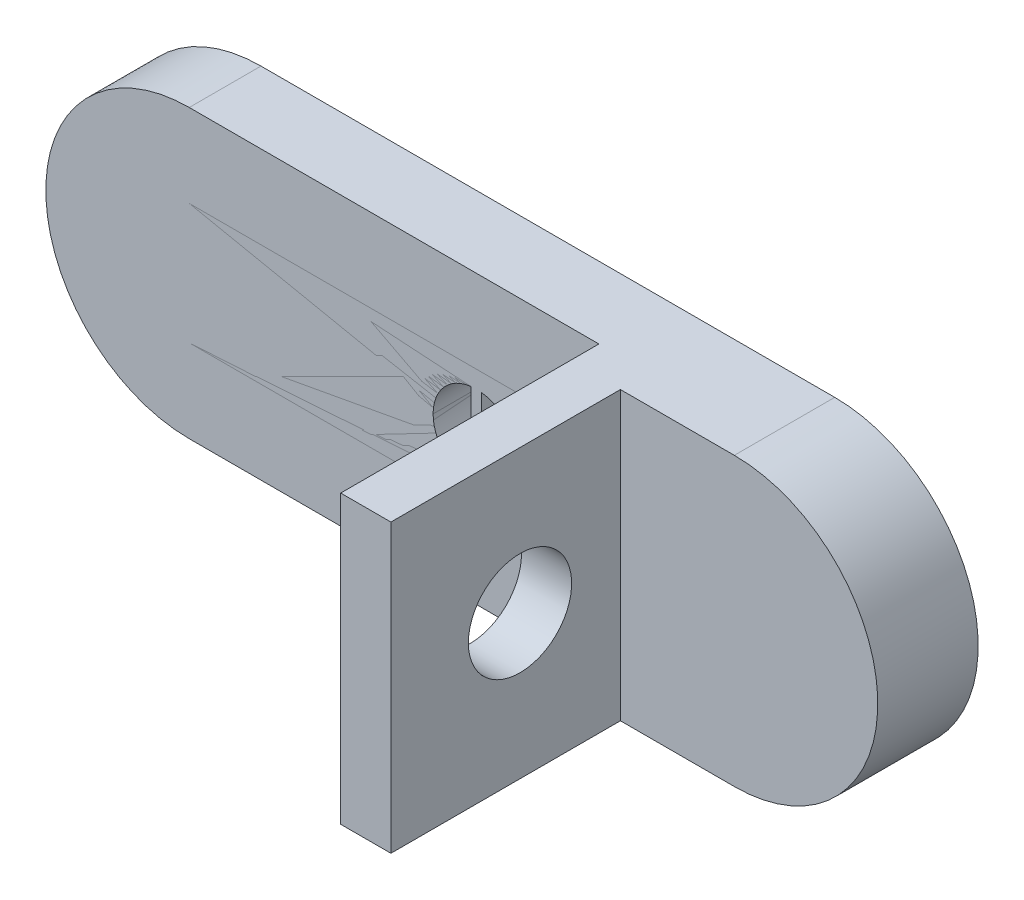
ISO-10303-21;
HEADER;
FILE_DESCRIPTION(('STEP AP214'),'2;1');
FILE_NAME('part.step','',(''),(''),'','','');
FILE_SCHEMA(('AUTOMOTIVE_DESIGN { 1 0 10303 214 1 1 1 1 }'));
ENDSEC;
DATA;
#1=APPLICATION_CONTEXT('core data for automotive mechanical design processes');
#2=APPLICATION_PROTOCOL_DEFINITION('international standard','automotive_design',2000,#1);
#3=PRODUCT_CONTEXT('',#1,'mechanical');
#4=PRODUCT('Part','Part','',(#3));
#5=PRODUCT_RELATED_PRODUCT_CATEGORY('part','',(#4));
#6=PRODUCT_DEFINITION_FORMATION('','',#4);
#7=PRODUCT_DEFINITION_CONTEXT('part definition',#1,'design');
#8=PRODUCT_DEFINITION('design','',#6,#7);
#9=PRODUCT_DEFINITION_SHAPE('','',#8);
#10=(LENGTH_UNIT() NAMED_UNIT(*) SI_UNIT(.MILLI.,.METRE.));
#11=(NAMED_UNIT(*) PLANE_ANGLE_UNIT() SI_UNIT($,.RADIAN.));
#12=(NAMED_UNIT(*) SI_UNIT($,.STERADIAN.) SOLID_ANGLE_UNIT());
#13=UNCERTAINTY_MEASURE_WITH_UNIT(LENGTH_MEASURE(1.E-05),#10,'distance_accuracy_value','');
#14=(GEOMETRIC_REPRESENTATION_CONTEXT(3) GLOBAL_UNCERTAINTY_ASSIGNED_CONTEXT((#13)) GLOBAL_UNIT_ASSIGNED_CONTEXT((#10,
#11,#12)) REPRESENTATION_CONTEXT('',''));
#15=CARTESIAN_POINT('',(0.,0.,0.));
#16=DIRECTION('',(0.,0.,1.));
#17=DIRECTION('',(1.,0.,0.));
#18=AXIS2_PLACEMENT_3D('',#15,#16,#17);
#19=CARTESIAN_POINT('',(0.,0.,5.));
#20=DIRECTION('',(0.,0.,-1.));
#21=DIRECTION('',(-1.,0.,0.));
#22=AXIS2_PLACEMENT_3D('',#19,#20,#21);
#23=CYLINDRICAL_SURFACE('',#22,3.);
#24=CARTESIAN_POINT('',(0.,0.,0.));
#25=DIRECTION('',(0.,0.,1.));
#26=DIRECTION('',(1.,0.,0.));
#27=AXIS2_PLACEMENT_3D('',#24,#25,#26);
#28=CIRCLE('',#27,3.);
#29=CARTESIAN_POINT('',(-0.375,2.97647022494767,0.));
#30=VERTEX_POINT('',#29);
#31=CARTESIAN_POINT('',(-0.375,-2.97647022494766,0.));
#32=VERTEX_POINT('',#31);
#33=EDGE_CURVE('E161',#30,#32,#28,.T.);
#34=ORIENTED_EDGE('',*,*,#33,.F.);
#35=DIRECTION('',(0.,0.,-1.));
#36=VECTOR('',#35,1.);
#37=CARTESIAN_POINT('',(-0.375,2.97647022494767,5.));
#38=LINE('',#37,#36);
#39=CARTESIAN_POINT('',(-0.375,2.97647022494767,5.));
#40=VERTEX_POINT('',#39);
#41=EDGE_CURVE('E13',#40,#30,#38,.T.);
#42=ORIENTED_EDGE('',*,*,#41,.F.);
#43=CARTESIAN_POINT('',(0.,0.,5.));
#44=DIRECTION('',(0.,0.,1.));
#45=DIRECTION('',(1.,0.,0.));
#46=AXIS2_PLACEMENT_3D('',#43,#44,#45);
#47=CIRCLE('',#46,3.);
#48=CARTESIAN_POINT('',(-0.375,-2.97647022494766,5.));
#49=VERTEX_POINT('',#48);
#50=EDGE_CURVE('E91',#40,#49,#47,.T.);
#51=ORIENTED_EDGE('',*,*,#50,.T.);
#52=DIRECTION('',(0.,0.,-1.));
#53=VECTOR('',#52,1.);
#54=CARTESIAN_POINT('',(-0.375,-2.97647022494766,5.));
#55=LINE('',#54,#53);
#56=EDGE_CURVE('E168',#49,#32,#55,.T.);
#57=ORIENTED_EDGE('',*,*,#56,.T.);
#58=EDGE_LOOP('',(#34,#42,#51,#57));
#59=FACE_BOUND('',#58,.T.);
#60=ADVANCED_FACE('F67',(#59),#23,.F.);
#61=CARTESIAN_POINT('',(0.375,-2.97647022494766,0.));
#62=VERTEX_POINT('',#61);
#63=CARTESIAN_POINT('',(0.375,2.97647022494767,0.));
#64=VERTEX_POINT('',#63);
#65=EDGE_CURVE('E109',#62,#64,#28,.T.);
#66=ORIENTED_EDGE('',*,*,#65,.F.);
#67=DIRECTION('',(0.,0.,-1.));
#68=VECTOR('',#67,1.);
#69=CARTESIAN_POINT('',(0.375,-2.97647022494766,5.));
#70=LINE('',#69,#68);
#71=CARTESIAN_POINT('',(0.375,-2.97647022494766,5.));
#72=VERTEX_POINT('',#71);
#73=EDGE_CURVE('E172',#72,#62,#70,.T.);
#74=ORIENTED_EDGE('',*,*,#73,.F.);
#75=CARTESIAN_POINT('',(0.375,2.97647022494767,5.));
#76=VERTEX_POINT('',#75);
#77=EDGE_CURVE('E173',#72,#76,#47,.T.);
#78=ORIENTED_EDGE('',*,*,#77,.T.);
#79=DIRECTION('',(0.,0.,-1.));
#80=VECTOR('',#79,1.);
#81=CARTESIAN_POINT('',(0.375,2.97647022494767,5.));
#82=LINE('',#81,#80);
#83=EDGE_CURVE('E75',#76,#64,#82,.T.);
#84=ORIENTED_EDGE('',*,*,#83,.T.);
#85=EDGE_LOOP('',(#66,#74,#78,#84));
#86=FACE_BOUND('',#85,.T.);
#87=ADVANCED_FACE('F69',(#86),#23,.F.);
#88=CARTESIAN_POINT('',(0.,0.,5.));
#89=DIRECTION('',(0.,0.,1.));
#90=DIRECTION('',(1.,0.,0.));
#91=AXIS2_PLACEMENT_3D('',#88,#89,#90);
#92=PLANE('',#91);
#93=ORIENTED_EDGE('',*,*,#77,.F.);
#94=DIRECTION('',(0.,1.,0.));
#95=VECTOR('',#94,1.);
#96=CARTESIAN_POINT('',(0.375,-3.,5.));
#97=LINE('',#96,#95);
#98=EDGE_CURVE('E176',#72,#76,#97,.T.);
#99=ORIENTED_EDGE('',*,*,#98,.T.);
#100=EDGE_LOOP('',(#93,#99));
#101=FACE_BOUND('',#100,.T.);
#102=DIRECTION('',(0.,-1.,0.));
#103=VECTOR('',#102,1.);
#104=CARTESIAN_POINT('',(8.55812951551174,0.,5.));
#105=LINE('',#104,#103);
#106=CARTESIAN_POINT('',(8.55812951551174,9.99999999999999,5.));
#107=VERTEX_POINT('',#106);
#108=CARTESIAN_POINT('',(8.55812951551174,-10.,5.));
#109=VERTEX_POINT('',#108);
#110=EDGE_CURVE('E217',#107,#109,#105,.T.);
#111=ORIENTED_EDGE('',*,*,#110,.F.);
#112=DIRECTION('',(1.,0.,0.));
#113=VECTOR('',#112,1.);
#114=CARTESIAN_POINT('',(0.,10.,5.));
#115=LINE('',#114,#113);
#116=CARTESIAN_POINT('',(-20.,9.99999999999999,5.));
#117=VERTEX_POINT('',#116);
#118=EDGE_CURVE('E228',#117,#107,#115,.T.);
#119=ORIENTED_EDGE('',*,*,#118,.F.);
#120=CARTESIAN_POINT('',(-20.,0.,5.));
#121=DIRECTION('',(0.,0.,1.));
#122=DIRECTION('',(1.,0.,0.));
#123=AXIS2_PLACEMENT_3D('',#120,#121,#122);
#124=CIRCLE('',#123,10.);
#125=CARTESIAN_POINT('',(-20.,-10.,5.));
#126=VERTEX_POINT('',#125);
#127=EDGE_CURVE('E232',#117,#126,#124,.T.);
#128=ORIENTED_EDGE('',*,*,#127,.T.);
#129=DIRECTION('',(1.,0.,0.));
#130=VECTOR('',#129,1.);
#131=CARTESIAN_POINT('',(0.,-10.,5.));
#132=LINE('',#131,#130);
#133=EDGE_CURVE('E225',#126,#109,#132,.T.);
#134=ORIENTED_EDGE('',*,*,#133,.T.);
#135=EDGE_LOOP('',(#111,#119,#128,#134));
#136=FACE_BOUND('',#135,.T.);
#137=ORIENTED_EDGE('',*,*,#50,.F.);
#138=DIRECTION('',(0.,1.,0.));
#139=VECTOR('',#138,1.);
#140=CARTESIAN_POINT('',(-0.375,-3.,5.));
#141=LINE('',#140,#139);
#142=EDGE_CURVE('E180',#49,#40,#141,.T.);
#143=ORIENTED_EDGE('',*,*,#142,.F.);
#144=EDGE_LOOP('',(#137,#143));
#145=FACE_BOUND('',#144,.T.);
#146=ADVANCED_FACE('F260',(#101,#136,#145),#92,.T.);
#147=CARTESIAN_POINT('',(0.,0.,0.));
#148=DIRECTION('',(0.,0.,1.));
#149=DIRECTION('',(1.,0.,0.));
#150=AXIS2_PLACEMENT_3D('',#147,#148,#149);
#151=PLANE('',#150);
#152=DIRECTION('',(0.,1.,0.));
#153=VECTOR('',#152,1.);
#154=CARTESIAN_POINT('',(0.375,-3.,0.));
#155=LINE('',#154,#153);
#156=EDGE_CURVE('E177',#62,#64,#155,.T.);
#157=ORIENTED_EDGE('',*,*,#156,.F.);
#158=ORIENTED_EDGE('',*,*,#65,.T.);
#159=EDGE_LOOP('',(#157,#158));
#160=FACE_BOUND('',#159,.T.);
#161=ORIENTED_EDGE('',*,*,#33,.T.);
#162=DIRECTION('',(0.,1.,0.));
#163=VECTOR('',#162,1.);
#164=CARTESIAN_POINT('',(-0.375,-3.,0.));
#165=LINE('',#164,#163);
#166=EDGE_CURVE('E165',#32,#30,#165,.T.);
#167=ORIENTED_EDGE('',*,*,#166,.T.);
#168=EDGE_LOOP('',(#161,#167));
#169=FACE_BOUND('',#168,.T.);
#170=DIRECTION('',(1.,0.,0.));
#171=VECTOR('',#170,1.);
#172=CARTESIAN_POINT('',(0.,10.,0.));
#173=LINE('',#172,#171);
#174=CARTESIAN_POINT('',(-20.,9.99999999999999,0.));
#175=VERTEX_POINT('',#174);
#176=CARTESIAN_POINT('',(20.,10.,0.));
#177=VERTEX_POINT('',#176);
#178=EDGE_CURVE('E239',#175,#177,#173,.T.);
#179=ORIENTED_EDGE('',*,*,#178,.T.);
#180=CARTESIAN_POINT('',(20.,0.,0.));
#181=DIRECTION('',(0.,0.,1.));
#182=DIRECTION('',(1.,0.,0.));
#183=AXIS2_PLACEMENT_3D('',#180,#181,#182);
#184=CIRCLE('',#183,10.);
#185=CARTESIAN_POINT('',(20.,-10.,0.));
#186=VERTEX_POINT('',#185);
#187=EDGE_CURVE('E236',#186,#177,#184,.T.);
#188=ORIENTED_EDGE('',*,*,#187,.F.);
#189=DIRECTION('',(1.,0.,0.));
#190=VECTOR('',#189,1.);
#191=CARTESIAN_POINT('',(0.,-10.,0.));
#192=LINE('',#191,#190);
#193=CARTESIAN_POINT('',(-20.,-10.,0.));
#194=VERTEX_POINT('',#193);
#195=EDGE_CURVE('E224',#194,#186,#192,.T.);
#196=ORIENTED_EDGE('',*,*,#195,.F.);
#197=CARTESIAN_POINT('',(-20.,0.,0.));
#198=DIRECTION('',(0.,0.,1.));
#199=DIRECTION('',(1.,0.,0.));
#200=AXIS2_PLACEMENT_3D('',#197,#198,#199);
#201=CIRCLE('',#200,10.);
#202=EDGE_CURVE('E229',#175,#194,#201,.T.);
#203=ORIENTED_EDGE('',*,*,#202,.F.);
#204=EDGE_LOOP('',(#179,#188,#196,#203));
#205=FACE_BOUND('',#204,.T.);
#206=ADVANCED_FACE('F162',(#160,#169,#205),#151,.F.);
#207=CARTESIAN_POINT('',(0.,-10.,5.));
#208=DIRECTION('',(0.,1.,0.));
#209=DIRECTION('',(-1.,0.,0.));
#210=AXIS2_PLACEMENT_3D('',#207,#208,#209);
#211=PLANE('',#210);
#212=DIRECTION('',(0.,0.,-1.));
#213=VECTOR('',#212,1.);
#214=CARTESIAN_POINT('',(20.,-10.,5.));
#215=LINE('',#214,#213);
#216=CARTESIAN_POINT('',(20.,-10.,7.));
#217=VERTEX_POINT('',#216);
#218=EDGE_CURVE('E166',#217,#186,#215,.T.);
#219=ORIENTED_EDGE('',*,*,#218,.F.);
#220=DIRECTION('',(-1.,0.,0.));
#221=VECTOR('',#220,1.);
#222=CARTESIAN_POINT('',(20.,-10.,7.));
#223=LINE('',#222,#221);
#224=CARTESIAN_POINT('',(12.0581295155117,-10.,7.));
#225=VERTEX_POINT('',#224);
#226=EDGE_CURVE('E190',#217,#225,#223,.T.);
#227=ORIENTED_EDGE('',*,*,#226,.T.);
#228=DIRECTION('',(0.,0.,1.));
#229=VECTOR('',#228,1.);
#230=CARTESIAN_POINT('',(12.0581295155117,-10.,0.));
#231=LINE('',#230,#229);
#232=CARTESIAN_POINT('',(12.0581295155117,-10.,23.));
#233=VERTEX_POINT('',#232);
#234=EDGE_CURVE('E82',#225,#233,#231,.T.);
#235=ORIENTED_EDGE('',*,*,#234,.T.);
#236=DIRECTION('',(1.,0.,0.));
#237=VECTOR('',#236,1.);
#238=CARTESIAN_POINT('',(8.55812951551174,-10.,23.));
#239=LINE('',#238,#237);
#240=CARTESIAN_POINT('',(8.55812951551174,-10.,23.));
#241=VERTEX_POINT('',#240);
#242=EDGE_CURVE('E212',#241,#233,#239,.T.);
#243=ORIENTED_EDGE('',*,*,#242,.F.);
#244=DIRECTION('',(0.,0.,1.));
#245=VECTOR('',#244,1.);
#246=CARTESIAN_POINT('',(8.55812951551174,-10.,0.));
#247=LINE('',#246,#245);
#248=EDGE_CURVE('E218',#109,#241,#247,.T.);
#249=ORIENTED_EDGE('',*,*,#248,.F.);
#250=ORIENTED_EDGE('',*,*,#133,.F.);
#251=DIRECTION('',(0.,0.,-1.));
#252=VECTOR('',#251,1.);
#253=CARTESIAN_POINT('',(-20.,-10.,5.));
#254=LINE('',#253,#252);
#255=EDGE_CURVE('E234',#126,#194,#254,.T.);
#256=ORIENTED_EDGE('',*,*,#255,.T.);
#257=ORIENTED_EDGE('',*,*,#195,.T.);
#258=EDGE_LOOP('',(#219,#227,#235,#243,#249,#250,#256,#257));
#259=FACE_BOUND('',#258,.T.);
#260=ADVANCED_FACE('F282',(#259),#211,.F.);
#261=CARTESIAN_POINT('',(20.,0.,5.));
#262=DIRECTION('',(0.,0.,-1.));
#263=DIRECTION('',(-1.,0.,0.));
#264=AXIS2_PLACEMENT_3D('',#261,#262,#263);
#265=CYLINDRICAL_SURFACE('',#264,10.);
#266=ORIENTED_EDGE('',*,*,#187,.T.);
#267=DIRECTION('',(0.,0.,-1.));
#268=VECTOR('',#267,1.);
#269=CARTESIAN_POINT('',(20.,10.,5.));
#270=LINE('',#269,#268);
#271=CARTESIAN_POINT('',(20.,10.,7.));
#272=VERTEX_POINT('',#271);
#273=EDGE_CURVE('E246',#272,#177,#270,.T.);
#274=ORIENTED_EDGE('',*,*,#273,.F.);
#275=CARTESIAN_POINT('',(20.,0.,7.));
#276=DIRECTION('',(0.,0.,1.));
#277=DIRECTION('',(1.,0.,0.));
#278=AXIS2_PLACEMENT_3D('',#275,#276,#277);
#279=CIRCLE('',#278,10.);
#280=EDGE_CURVE('E186',#217,#272,#279,.T.);
#281=ORIENTED_EDGE('',*,*,#280,.F.);
#282=ORIENTED_EDGE('',*,*,#218,.T.);
#283=EDGE_LOOP('',(#266,#274,#281,#282));
#284=FACE_BOUND('',#283,.T.);
#285=ADVANCED_FACE('F295',(#284),#265,.T.);
#286=CARTESIAN_POINT('',(0.,10.,5.));
#287=DIRECTION('',(0.,1.,0.));
#288=DIRECTION('',(-1.,0.,0.));
#289=AXIS2_PLACEMENT_3D('',#286,#287,#288);
#290=PLANE('',#289);
#291=DIRECTION('',(-1.,0.,0.));
#292=VECTOR('',#291,1.);
#293=CARTESIAN_POINT('',(20.,10.,7.));
#294=LINE('',#293,#292);
#295=CARTESIAN_POINT('',(12.0581295155117,10.,7.));
#296=VERTEX_POINT('',#295);
#297=EDGE_CURVE('E191',#272,#296,#294,.T.);
#298=ORIENTED_EDGE('',*,*,#297,.F.);
#299=ORIENTED_EDGE('',*,*,#273,.T.);
#300=ORIENTED_EDGE('',*,*,#178,.F.);
#301=DIRECTION('',(0.,0.,-1.));
#302=VECTOR('',#301,1.);
#303=CARTESIAN_POINT('',(-20.,9.99999999999999,5.));
#304=LINE('',#303,#302);
#305=EDGE_CURVE('E244',#117,#175,#304,.T.);
#306=ORIENTED_EDGE('',*,*,#305,.F.);
#307=ORIENTED_EDGE('',*,*,#118,.T.);
#308=DIRECTION('',(0.,0.,1.));
#309=VECTOR('',#308,1.);
#310=CARTESIAN_POINT('',(8.55812951551174,9.99999999999999,0.));
#311=LINE('',#310,#309);
#312=CARTESIAN_POINT('',(8.55812951551174,9.99999999999999,23.));
#313=VERTEX_POINT('',#312);
#314=EDGE_CURVE('E220',#107,#313,#311,.T.);
#315=ORIENTED_EDGE('',*,*,#314,.T.);
#316=DIRECTION('',(-1.,0.,0.));
#317=VECTOR('',#316,1.);
#318=CARTESIAN_POINT('',(8.55812951551174,9.99999999999999,23.));
#319=LINE('',#318,#317);
#320=CARTESIAN_POINT('',(12.0581295155117,9.99999999999999,23.));
#321=VERTEX_POINT('',#320);
#322=EDGE_CURVE('E206',#321,#313,#319,.T.);
#323=ORIENTED_EDGE('',*,*,#322,.F.);
#324=DIRECTION('',(0.,0.,1.));
#325=VECTOR('',#324,1.);
#326=CARTESIAN_POINT('',(12.0581295155117,9.99999999999999,0.));
#327=LINE('',#326,#325);
#328=EDGE_CURVE('E215',#296,#321,#327,.T.);
#329=ORIENTED_EDGE('',*,*,#328,.F.);
#330=EDGE_LOOP('',(#298,#299,#300,#306,#307,#315,#323,#329));
#331=FACE_BOUND('',#330,.T.);
#332=ADVANCED_FACE('F272',(#331),#290,.T.);
#333=CARTESIAN_POINT('',(-20.,0.,5.));
#334=DIRECTION('',(0.,0.,-1.));
#335=DIRECTION('',(-1.,0.,0.));
#336=AXIS2_PLACEMENT_3D('',#333,#334,#335);
#337=CYLINDRICAL_SURFACE('',#336,10.);
#338=ORIENTED_EDGE('',*,*,#202,.T.);
#339=ORIENTED_EDGE('',*,*,#255,.F.);
#340=ORIENTED_EDGE('',*,*,#127,.F.);
#341=ORIENTED_EDGE('',*,*,#305,.T.);
#342=EDGE_LOOP('',(#338,#339,#340,#341));
#343=FACE_BOUND('',#342,.T.);
#344=ADVANCED_FACE('F279',(#343),#337,.T.);
#345=CARTESIAN_POINT('',(12.0581295155117,9.99999999999999,0.));
#346=DIRECTION('',(1.,0.,0.));
#347=DIRECTION('',(0.,0.,-1.));
#348=AXIS2_PLACEMENT_3D('',#345,#346,#347);
#349=PLANE('',#348);
#350=DIRECTION('',(0.,-1.,0.));
#351=VECTOR('',#350,1.);
#352=CARTESIAN_POINT('',(12.0581295155117,10.,7.));
#353=LINE('',#352,#351);
#354=EDGE_CURVE('E194',#296,#225,#353,.T.);
#355=ORIENTED_EDGE('',*,*,#354,.F.);
#356=ORIENTED_EDGE('',*,*,#328,.T.);
#357=DIRECTION('',(0.,1.,0.));
#358=VECTOR('',#357,1.);
#359=CARTESIAN_POINT('',(12.0581295155117,9.99999999999999,23.));
#360=LINE('',#359,#358);
#361=EDGE_CURVE('E201',#233,#321,#360,.T.);
#362=ORIENTED_EDGE('',*,*,#361,.F.);
#363=ORIENTED_EDGE('',*,*,#234,.F.);
#364=EDGE_LOOP('',(#355,#356,#362,#363));
#365=FACE_BOUND('',#364,.T.);
#366=CARTESIAN_POINT('',(12.0581295155117,0.,14.));
#367=DIRECTION('',(-1.,0.,0.));
#368=DIRECTION('',(0.,0.,1.));
#369=AXIS2_PLACEMENT_3D('',#366,#367,#368);
#370=CIRCLE('',#369,3.6);
#371=CARTESIAN_POINT('',(12.0581295155117,0.,17.6));
#372=VERTEX_POINT('',#371);
#373=EDGE_CURVE('E198',#372,#372,#370,.T.);
#374=ORIENTED_EDGE('',*,*,#373,.T.);
#375=EDGE_LOOP('',(#374));
#376=FACE_BOUND('',#375,.T.);
#377=ADVANCED_FACE('F288',(#365,#376),#349,.T.);
#378=CARTESIAN_POINT('',(8.55812951551174,9.99999999999999,0.));
#379=DIRECTION('',(-1.,0.,0.));
#380=DIRECTION('',(0.,0.,1.));
#381=AXIS2_PLACEMENT_3D('',#378,#379,#380);
#382=PLANE('',#381);
#383=CARTESIAN_POINT('',(8.55812951551174,0.,14.));
#384=DIRECTION('',(-1.,0.,0.));
#385=DIRECTION('',(0.,0.,1.));
#386=AXIS2_PLACEMENT_3D('',#383,#384,#385);
#387=CIRCLE('',#386,3.6);
#388=CARTESIAN_POINT('',(8.55812951551174,0.,17.6));
#389=VERTEX_POINT('',#388);
#390=EDGE_CURVE('E189',#389,#389,#387,.T.);
#391=ORIENTED_EDGE('',*,*,#390,.F.);
#392=EDGE_LOOP('',(#391));
#393=FACE_BOUND('',#392,.T.);
#394=ORIENTED_EDGE('',*,*,#314,.F.);
#395=ORIENTED_EDGE('',*,*,#110,.T.);
#396=ORIENTED_EDGE('',*,*,#248,.T.);
#397=DIRECTION('',(0.,-1.,0.));
#398=VECTOR('',#397,1.);
#399=CARTESIAN_POINT('',(8.55812951551174,9.99999999999999,23.));
#400=LINE('',#399,#398);
#401=EDGE_CURVE('E209',#313,#241,#400,.T.);
#402=ORIENTED_EDGE('',*,*,#401,.F.);
#403=EDGE_LOOP('',(#394,#395,#396,#402));
#404=FACE_BOUND('',#403,.T.);
#405=ADVANCED_FACE('F285',(#393,#404),#382,.T.);
#406=CARTESIAN_POINT('',(0.,0.,23.));
#407=DIRECTION('',(0.,0.,1.));
#408=DIRECTION('',(1.,0.,0.));
#409=AXIS2_PLACEMENT_3D('',#406,#407,#408);
#410=PLANE('',#409);
#411=ORIENTED_EDGE('',*,*,#361,.T.);
#412=ORIENTED_EDGE('',*,*,#322,.T.);
#413=ORIENTED_EDGE('',*,*,#401,.T.);
#414=ORIENTED_EDGE('',*,*,#242,.T.);
#415=EDGE_LOOP('',(#411,#412,#413,#414));
#416=FACE_BOUND('',#415,.T.);
#417=ADVANCED_FACE('F287',(#416),#410,.T.);
#418=CARTESIAN_POINT('',(12.0581295155117,0.,14.));
#419=DIRECTION('',(-1.,0.,0.));
#420=DIRECTION('',(0.,0.,1.));
#421=AXIS2_PLACEMENT_3D('',#418,#419,#420);
#422=CYLINDRICAL_SURFACE('',#421,3.6);
#423=ORIENTED_EDGE('',*,*,#373,.F.);
#424=EDGE_LOOP('',(#423));
#425=FACE_BOUND('',#424,.T.);
#426=ORIENTED_EDGE('',*,*,#390,.T.);
#427=EDGE_LOOP('',(#426));
#428=FACE_BOUND('',#427,.T.);
#429=ADVANCED_FACE('F342',(#425,#428),#422,.F.);
#430=CARTESIAN_POINT('',(0.,0.,7.));
#431=DIRECTION('',(0.,0.,1.));
#432=DIRECTION('',(1.,0.,0.));
#433=AXIS2_PLACEMENT_3D('',#430,#431,#432);
#434=PLANE('',#433);
#435=ORIENTED_EDGE('',*,*,#280,.T.);
#436=ORIENTED_EDGE('',*,*,#297,.T.);
#437=ORIENTED_EDGE('',*,*,#354,.T.);
#438=ORIENTED_EDGE('',*,*,#226,.F.);
#439=EDGE_LOOP('',(#435,#436,#437,#438));
#440=FACE_BOUND('',#439,.T.);
#441=ADVANCED_FACE('F292',(#440),#434,.T.);
#442=CARTESIAN_POINT('',(0.375,-3.,5.));
#443=DIRECTION('',(-1.,0.,0.));
#444=DIRECTION('',(0.,0.,1.));
#445=AXIS2_PLACEMENT_3D('',#442,#443,#444);
#446=PLANE('',#445);
#447=ORIENTED_EDGE('',*,*,#83,.F.);
#448=ORIENTED_EDGE('',*,*,#98,.F.);
#449=ORIENTED_EDGE('',*,*,#73,.T.);
#450=ORIENTED_EDGE('',*,*,#156,.T.);
#451=EDGE_LOOP('',(#447,#448,#449,#450));
#452=FACE_BOUND('',#451,.T.);
#453=ADVANCED_FACE('F258',(#452),#446,.F.);
#454=CARTESIAN_POINT('',(-0.375,-3.,5.));
#455=DIRECTION('',(-1.,0.,0.));
#456=DIRECTION('',(0.,0.,1.));
#457=AXIS2_PLACEMENT_3D('',#454,#455,#456);
#458=PLANE('',#457);
#459=ORIENTED_EDGE('',*,*,#142,.T.);
#460=ORIENTED_EDGE('',*,*,#41,.T.);
#461=ORIENTED_EDGE('',*,*,#166,.F.);
#462=ORIENTED_EDGE('',*,*,#56,.F.);
#463=EDGE_LOOP('',(#459,#460,#461,#462));
#464=FACE_BOUND('',#463,.T.);
#465=ADVANCED_FACE('F175',(#464),#458,.T.);
#466=CLOSED_SHELL('',(#60,#87,#146,#206,#260,#285,#332,#344,#377,#405,#417,#429,#441,#453,#465));
#467=MANIFOLD_SOLID_BREP('B2',#466);
#468=CARTESIAN_POINT('',(0.,4.20939513579106,5.));
#469=DIRECTION('',(0.,-1.,0.));
#470=DIRECTION('',(1.,0.,0.));
#471=AXIS2_PLACEMENT_3D('',#468,#469,#470);
#472=PLANE('',#471);
#473=DIRECTION('',(-1.,0.,0.));
#474=VECTOR('',#473,1.);
#475=CARTESIAN_POINT('',(0.,4.20939513579106,0.));
#476=LINE('',#475,#474);
#477=CARTESIAN_POINT('',(20.,4.20939513579106,0.));
#478=VERTEX_POINT('',#477);
#479=CARTESIAN_POINT('',(-20.,4.20939513579106,0.));
#480=VERTEX_POINT('',#479);
#481=EDGE_CURVE('E551',#478,#480,#476,.T.);
#482=ORIENTED_EDGE('',*,*,#481,.T.);
#483=DIRECTION('',(0.,0.,-1.));
#484=VECTOR('',#483,1.);
#485=CARTESIAN_POINT('',(-20.,4.20939513579106,5.));
#486=LINE('',#485,#484);
#487=CARTESIAN_POINT('',(-20.,4.20939513579106,5.));
#488=VERTEX_POINT('',#487);
#489=EDGE_CURVE('E65',#488,#480,#486,.T.);
#490=ORIENTED_EDGE('',*,*,#489,.F.);
#491=DIRECTION('',(-1.,0.,0.));
#492=VECTOR('',#491,1.);
#493=CARTESIAN_POINT('',(0.,4.20939513579106,5.));
#494=LINE('',#493,#492);
#495=CARTESIAN_POINT('',(20.,4.20939513579106,5.));
#496=VERTEX_POINT('',#495);
#497=EDGE_CURVE('E529',#496,#488,#494,.T.);
#498=ORIENTED_EDGE('',*,*,#497,.F.);
#499=DIRECTION('',(0.,0.,-1.));
#500=VECTOR('',#499,1.);
#501=CARTESIAN_POINT('',(20.,4.20939513579106,5.));
#502=LINE('',#501,#500);
#503=EDGE_CURVE('E559',#496,#478,#502,.T.);
#504=ORIENTED_EDGE('',*,*,#503,.T.);
#505=EDGE_LOOP('',(#482,#490,#498,#504));
#506=FACE_BOUND('',#505,.T.);
#507=ADVANCED_FACE('F454',(#506),#472,.F.);
#508=CARTESIAN_POINT('',(-20.,0.,5.));
#509=DIRECTION('',(0.,0.,-1.));
#510=DIRECTION('',(-1.,0.,0.));
#511=AXIS2_PLACEMENT_3D('',#508,#509,#510);
#512=CYLINDRICAL_SURFACE('',#511,4.20939513579107);
#513=CARTESIAN_POINT('',(-20.,0.,0.));
#514=DIRECTION('',(0.,0.,1.));
#515=DIRECTION('',(1.,0.,0.));
#516=AXIS2_PLACEMENT_3D('',#513,#514,#515);
#517=CIRCLE('',#516,4.20939513579107);
#518=CARTESIAN_POINT('',(-20.,-4.20939513579108,0.));
#519=VERTEX_POINT('',#518);
#520=EDGE_CURVE('E535',#480,#519,#517,.T.);
#521=ORIENTED_EDGE('',*,*,#520,.T.);
#522=DIRECTION('',(0.,0.,-1.));
#523=VECTOR('',#522,1.);
#524=CARTESIAN_POINT('',(-20.,-4.20939513579108,5.));
#525=LINE('',#524,#523);
#526=CARTESIAN_POINT('',(-20.,-4.20939513579108,5.));
#527=VERTEX_POINT('',#526);
#528=EDGE_CURVE('E464',#527,#519,#525,.T.);
#529=ORIENTED_EDGE('',*,*,#528,.F.);
#530=CARTESIAN_POINT('',(-20.,0.,5.));
#531=DIRECTION('',(0.,0.,1.));
#532=DIRECTION('',(1.,0.,0.));
#533=AXIS2_PLACEMENT_3D('',#530,#531,#532);
#534=CIRCLE('',#533,4.20939513579107);
#535=EDGE_CURVE('E523',#488,#527,#534,.T.);
#536=ORIENTED_EDGE('',*,*,#535,.F.);
#537=ORIENTED_EDGE('',*,*,#489,.T.);
#538=EDGE_LOOP('',(#521,#529,#536,#537));
#539=FACE_BOUND('',#538,.T.);
#540=ADVANCED_FACE('F534',(#539),#512,.T.);
#541=CARTESIAN_POINT('',(0.,-4.20939513579107,5.));
#542=DIRECTION('',(0.,-1.,0.));
#543=DIRECTION('',(1.,0.,0.));
#544=AXIS2_PLACEMENT_3D('',#541,#542,#543);
#545=PLANE('',#544);
#546=DIRECTION('',(-1.,0.,0.));
#547=VECTOR('',#546,1.);
#548=CARTESIAN_POINT('',(0.,-4.20939513579107,0.));
#549=LINE('',#548,#547);
#550=CARTESIAN_POINT('',(20.,-4.20939513579107,0.));
#551=VERTEX_POINT('',#550);
#552=EDGE_CURVE('E555',#551,#519,#549,.T.);
#553=ORIENTED_EDGE('',*,*,#552,.F.);
#554=DIRECTION('',(0.,0.,-1.));
#555=VECTOR('',#554,1.);
#556=CARTESIAN_POINT('',(20.,-4.20939513579107,5.));
#557=LINE('',#556,#555);
#558=CARTESIAN_POINT('',(20.,-4.20939513579107,5.));
#559=VERTEX_POINT('',#558);
#560=EDGE_CURVE('E499',#559,#551,#557,.T.);
#561=ORIENTED_EDGE('',*,*,#560,.F.);
#562=DIRECTION('',(-1.,0.,0.));
#563=VECTOR('',#562,1.);
#564=CARTESIAN_POINT('',(0.,-4.20939513579107,5.));
#565=LINE('',#564,#563);
#566=EDGE_CURVE('E527',#559,#527,#565,.T.);
#567=ORIENTED_EDGE('',*,*,#566,.T.);
#568=ORIENTED_EDGE('',*,*,#528,.T.);
#569=EDGE_LOOP('',(#553,#561,#567,#568));
#570=FACE_BOUND('',#569,.T.);
#571=ADVANCED_FACE('F540',(#570),#545,.T.);
#572=CARTESIAN_POINT('',(0.,0.,5.));
#573=DIRECTION('',(0.,0.,-1.));
#574=DIRECTION('',(-1.,0.,0.));
#575=AXIS2_PLACEMENT_3D('',#572,#573,#574);
#576=CYLINDRICAL_SURFACE('',#575,3.);
#577=CARTESIAN_POINT('',(0.,0.,0.));
#578=DIRECTION('',(0.,0.,1.));
#579=DIRECTION('',(1.,0.,0.));
#580=AXIS2_PLACEMENT_3D('',#577,#578,#579);
#581=CIRCLE('',#580,3.);
#582=CARTESIAN_POINT('',(-0.375,2.97647022494767,0.));
#583=VERTEX_POINT('',#582);
#584=CARTESIAN_POINT('',(-0.375,-2.97647022494766,0.));
#585=VERTEX_POINT('',#584);
#586=EDGE_CURVE('E546',#583,#585,#581,.T.);
#587=ORIENTED_EDGE('',*,*,#586,.F.);
#588=DIRECTION('',(0.,0.,-1.));
#589=VECTOR('',#588,1.);
#590=CARTESIAN_POINT('',(-0.375,2.97647022494767,5.));
#591=LINE('',#590,#589);
#592=CARTESIAN_POINT('',(-0.375,2.97647022494767,5.));
#593=VERTEX_POINT('',#592);
#594=EDGE_CURVE('E458',#593,#583,#591,.T.);
#595=ORIENTED_EDGE('',*,*,#594,.F.);
#596=CARTESIAN_POINT('',(0.,0.,5.));
#597=DIRECTION('',(0.,0.,1.));
#598=DIRECTION('',(1.,0.,0.));
#599=AXIS2_PLACEMENT_3D('',#596,#597,#598);
#600=CIRCLE('',#599,3.);
#601=CARTESIAN_POINT('',(-0.375,-2.97647022494766,5.));
#602=VERTEX_POINT('',#601);
#603=EDGE_CURVE('E558',#593,#602,#600,.T.);
#604=ORIENTED_EDGE('',*,*,#603,.T.);
#605=DIRECTION('',(0.,0.,-1.));
#606=VECTOR('',#605,1.);
#607=CARTESIAN_POINT('',(-0.375,-2.97647022494766,5.));
#608=LINE('',#607,#606);
#609=EDGE_CURVE('E542',#602,#585,#608,.T.);
#610=ORIENTED_EDGE('',*,*,#609,.T.);
#611=EDGE_LOOP('',(#587,#595,#604,#610));
#612=FACE_BOUND('',#611,.T.);
#613=ADVANCED_FACE('F601',(#612),#576,.F.);
#614=CARTESIAN_POINT('',(0.375,-2.97647022494766,0.));
#615=VERTEX_POINT('',#614);
#616=CARTESIAN_POINT('',(0.375,2.97647022494767,0.));
#617=VERTEX_POINT('',#616);
#618=EDGE_CURVE('E549',#615,#617,#581,.T.);
#619=ORIENTED_EDGE('',*,*,#618,.F.);
#620=DIRECTION('',(0.,0.,-1.));
#621=VECTOR('',#620,1.);
#622=CARTESIAN_POINT('',(0.375,-2.97647022494766,5.));
#623=LINE('',#622,#621);
#624=CARTESIAN_POINT('',(0.375,-2.97647022494766,5.));
#625=VERTEX_POINT('',#624);
#626=EDGE_CURVE('E564',#625,#615,#623,.T.);
#627=ORIENTED_EDGE('',*,*,#626,.F.);
#628=CARTESIAN_POINT('',(0.375,2.97647022494767,5.));
#629=VERTEX_POINT('',#628);
#630=EDGE_CURVE('E590',#625,#629,#600,.T.);
#631=ORIENTED_EDGE('',*,*,#630,.T.);
#632=DIRECTION('',(0.,0.,-1.));
#633=VECTOR('',#632,1.);
#634=CARTESIAN_POINT('',(0.375,2.97647022494767,5.));
#635=LINE('',#634,#633);
#636=EDGE_CURVE('E566',#629,#617,#635,.T.);
#637=ORIENTED_EDGE('',*,*,#636,.T.);
#638=EDGE_LOOP('',(#619,#627,#631,#637));
#639=FACE_BOUND('',#638,.T.);
#640=ADVANCED_FACE('F456',(#639),#576,.F.);
#641=CARTESIAN_POINT('',(20.,0.,5.));
#642=DIRECTION('',(0.,0.,-1.));
#643=DIRECTION('',(-1.,0.,0.));
#644=AXIS2_PLACEMENT_3D('',#641,#642,#643);
#645=CYLINDRICAL_SURFACE('',#644,4.20939513579107);
#646=CARTESIAN_POINT('',(20.,0.,0.));
#647=DIRECTION('',(0.,0.,1.));
#648=DIRECTION('',(1.,0.,0.));
#649=AXIS2_PLACEMENT_3D('',#646,#647,#648);
#650=CIRCLE('',#649,4.20939513579107);
#651=EDGE_CURVE('E502',#551,#478,#650,.T.);
#652=ORIENTED_EDGE('',*,*,#651,.T.);
#653=ORIENTED_EDGE('',*,*,#503,.F.);
#654=CARTESIAN_POINT('',(20.,0.,5.));
#655=DIRECTION('',(0.,0.,1.));
#656=DIRECTION('',(1.,0.,0.));
#657=AXIS2_PLACEMENT_3D('',#654,#655,#656);
#658=CIRCLE('',#657,4.20939513579107);
#659=EDGE_CURVE('E473',#559,#496,#658,.T.);
#660=ORIENTED_EDGE('',*,*,#659,.F.);
#661=ORIENTED_EDGE('',*,*,#560,.T.);
#662=EDGE_LOOP('',(#652,#653,#660,#661));
#663=FACE_BOUND('',#662,.T.);
#664=ADVANCED_FACE('F599',(#663),#645,.T.);
#665=CARTESIAN_POINT('',(0.,0.,5.));
#666=DIRECTION('',(0.,0.,1.));
#667=DIRECTION('',(1.,0.,0.));
#668=AXIS2_PLACEMENT_3D('',#665,#666,#667);
#669=PLANE('',#668);
#670=ORIENTED_EDGE('',*,*,#630,.F.);
#671=DIRECTION('',(0.,1.,0.));
#672=VECTOR('',#671,1.);
#673=CARTESIAN_POINT('',(0.375,-3.,5.));
#674=LINE('',#673,#672);
#675=EDGE_CURVE('E581',#625,#629,#674,.T.);
#676=ORIENTED_EDGE('',*,*,#675,.T.);
#677=EDGE_LOOP('',(#670,#676));
#678=FACE_BOUND('',#677,.T.);
#679=ORIENTED_EDGE('',*,*,#603,.F.);
#680=DIRECTION('',(0.,1.,0.));
#681=VECTOR('',#680,1.);
#682=CARTESIAN_POINT('',(-0.375,-3.,5.));
#683=LINE('',#682,#681);
#684=EDGE_CURVE('E550',#602,#593,#683,.T.);
#685=ORIENTED_EDGE('',*,*,#684,.F.);
#686=EDGE_LOOP('',(#679,#685));
#687=FACE_BOUND('',#686,.T.);
#688=ORIENTED_EDGE('',*,*,#497,.T.);
#689=ORIENTED_EDGE('',*,*,#535,.T.);
#690=ORIENTED_EDGE('',*,*,#566,.F.);
#691=ORIENTED_EDGE('',*,*,#659,.T.);
#692=EDGE_LOOP('',(#688,#689,#690,#691));
#693=FACE_BOUND('',#692,.T.);
#694=ADVANCED_FACE('F525',(#678,#687,#693),#669,.T.);
#695=CARTESIAN_POINT('',(0.,0.,0.));
#696=DIRECTION('',(0.,0.,1.));
#697=DIRECTION('',(1.,0.,0.));
#698=AXIS2_PLACEMENT_3D('',#695,#696,#697);
#699=PLANE('',#698);
#700=DIRECTION('',(0.,1.,0.));
#701=VECTOR('',#700,1.);
#702=CARTESIAN_POINT('',(0.375,-3.,0.));
#703=LINE('',#702,#701);
#704=EDGE_CURVE('E582',#615,#617,#703,.T.);
#705=ORIENTED_EDGE('',*,*,#704,.F.);
#706=ORIENTED_EDGE('',*,*,#618,.T.);
#707=EDGE_LOOP('',(#705,#706));
#708=FACE_BOUND('',#707,.T.);
#709=ORIENTED_EDGE('',*,*,#586,.T.);
#710=DIRECTION('',(0.,1.,0.));
#711=VECTOR('',#710,1.);
#712=CARTESIAN_POINT('',(-0.375,-3.,0.));
#713=LINE('',#712,#711);
#714=EDGE_CURVE('E576',#585,#583,#713,.T.);
#715=ORIENTED_EDGE('',*,*,#714,.T.);
#716=EDGE_LOOP('',(#709,#715));
#717=FACE_BOUND('',#716,.T.);
#718=ORIENTED_EDGE('',*,*,#481,.F.);
#719=ORIENTED_EDGE('',*,*,#651,.F.);
#720=ORIENTED_EDGE('',*,*,#552,.T.);
#721=ORIENTED_EDGE('',*,*,#520,.F.);
#722=EDGE_LOOP('',(#718,#719,#720,#721));
#723=FACE_BOUND('',#722,.T.);
#724=ADVANCED_FACE('F579',(#708,#717,#723),#699,.F.);
#725=CARTESIAN_POINT('',(0.375,-3.,5.));
#726=DIRECTION('',(-1.,0.,0.));
#727=DIRECTION('',(0.,0.,1.));
#728=AXIS2_PLACEMENT_3D('',#725,#726,#727);
#729=PLANE('',#728);
#730=ORIENTED_EDGE('',*,*,#636,.F.);
#731=ORIENTED_EDGE('',*,*,#675,.F.);
#732=ORIENTED_EDGE('',*,*,#626,.T.);
#733=ORIENTED_EDGE('',*,*,#704,.T.);
#734=EDGE_LOOP('',(#730,#731,#732,#733));
#735=FACE_BOUND('',#734,.T.);
#736=ADVANCED_FACE('F595',(#735),#729,.F.);
#737=CARTESIAN_POINT('',(-0.375,-3.,5.));
#738=DIRECTION('',(-1.,0.,0.));
#739=DIRECTION('',(0.,0.,1.));
#740=AXIS2_PLACEMENT_3D('',#737,#738,#739);
#741=PLANE('',#740);
#742=ORIENTED_EDGE('',*,*,#684,.T.);
#743=ORIENTED_EDGE('',*,*,#594,.T.);
#744=ORIENTED_EDGE('',*,*,#714,.F.);
#745=ORIENTED_EDGE('',*,*,#609,.F.);
#746=EDGE_LOOP('',(#742,#743,#744,#745));
#747=FACE_BOUND('',#746,.T.);
#748=ADVANCED_FACE('F574',(#747),#741,.T.);
#749=CLOSED_SHELL('',(#507,#540,#571,#613,#640,#664,#694,#724,#736,#748));
#750=MANIFOLD_SOLID_BREP('B7_NOT_SHOWN',#749);
#751=ADVANCED_BREP_SHAPE_REPRESENTATION('',(#18,#467,#750),#14);
#752=SHAPE_DEFINITION_REPRESENTATION(#9,#751);
ENDSEC;
END-ISO-10303-21;
